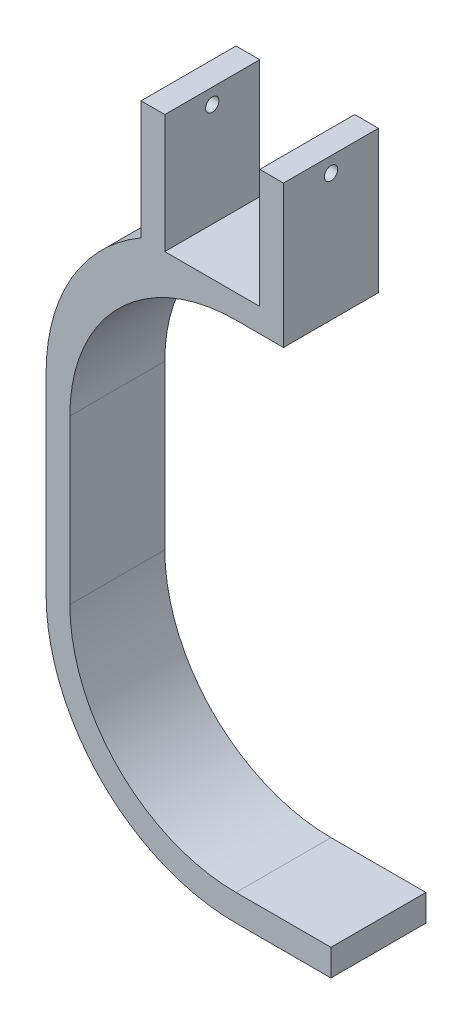
ISO-10303-21;
HEADER;
FILE_DESCRIPTION(('STEP AP214'),'2;1');
FILE_NAME('part.step','',(''),(''),'','','');
FILE_SCHEMA(('AUTOMOTIVE_DESIGN { 1 0 10303 214 1 1 1 1 }'));
ENDSEC;
DATA;
#1=APPLICATION_CONTEXT('core data for automotive mechanical design processes');
#2=APPLICATION_PROTOCOL_DEFINITION('international standard','automotive_design',2000,#1);
#3=PRODUCT_CONTEXT('',#1,'mechanical');
#4=PRODUCT('Part','Part','',(#3));
#5=PRODUCT_RELATED_PRODUCT_CATEGORY('part','',(#4));
#6=PRODUCT_DEFINITION_FORMATION('','',#4);
#7=PRODUCT_DEFINITION_CONTEXT('part definition',#1,'design');
#8=PRODUCT_DEFINITION('design','',#6,#7);
#9=PRODUCT_DEFINITION_SHAPE('','',#8);
#10=(LENGTH_UNIT() NAMED_UNIT(*) SI_UNIT(.MILLI.,.METRE.));
#11=(NAMED_UNIT(*) PLANE_ANGLE_UNIT() SI_UNIT($,.RADIAN.));
#12=(NAMED_UNIT(*) SI_UNIT($,.STERADIAN.) SOLID_ANGLE_UNIT());
#13=UNCERTAINTY_MEASURE_WITH_UNIT(LENGTH_MEASURE(1.E-05),#10,'distance_accuracy_value','');
#14=(GEOMETRIC_REPRESENTATION_CONTEXT(3) GLOBAL_UNCERTAINTY_ASSIGNED_CONTEXT((#13)) GLOBAL_UNIT_ASSIGNED_CONTEXT((#10,
#11,#12)) REPRESENTATION_CONTEXT('',''));
#15=CARTESIAN_POINT('',(0.,0.,0.));
#16=DIRECTION('',(0.,0.,1.));
#17=DIRECTION('',(1.,0.,0.));
#18=AXIS2_PLACEMENT_3D('',#15,#16,#17);
#19=CARTESIAN_POINT('',(0.,-82.7776810365037,20.));
#20=DIRECTION('',(0.,1.,0.));
#21=DIRECTION('',(0.,0.,1.));
#22=AXIS2_PLACEMENT_3D('',#19,#20,#21);
#23=PLANE('',#22);
#24=DIRECTION('',(1.,0.,0.));
#25=VECTOR('',#24,1.);
#26=CARTESIAN_POINT('',(0.,-82.7776810365037,20.));
#27=LINE('',#26,#25);
#28=CARTESIAN_POINT('',(26.4485078252592,-82.7776810365037,20.));
#29=VERTEX_POINT('',#28);
#30=CARTESIAN_POINT('',(46.4485078252592,-82.7776810365037,20.));
#31=VERTEX_POINT('',#30);
#32=EDGE_CURVE('E205',#29,#31,#27,.T.);
#33=ORIENTED_EDGE('',*,*,#32,.F.);
#34=DIRECTION('',(0.,0.,-1.));
#35=VECTOR('',#34,1.);
#36=CARTESIAN_POINT('',(26.4485078252592,-82.7776810365037,20.));
#37=LINE('',#36,#35);
#38=CARTESIAN_POINT('',(26.4485078252592,-82.7776810365037,0.));
#39=VERTEX_POINT('',#38);
#40=EDGE_CURVE('E284',#29,#39,#37,.T.);
#41=ORIENTED_EDGE('',*,*,#40,.T.);
#42=DIRECTION('',(1.,0.,0.));
#43=VECTOR('',#42,1.);
#44=CARTESIAN_POINT('',(0.,-82.7776810365037,0.));
#45=LINE('',#44,#43);
#46=CARTESIAN_POINT('',(46.4485078252592,-82.7776810365037,0.));
#47=VERTEX_POINT('',#46);
#48=EDGE_CURVE('E204',#39,#47,#45,.T.);
#49=ORIENTED_EDGE('',*,*,#48,.T.);
#50=DIRECTION('',(0.,0.,-1.));
#51=VECTOR('',#50,1.);
#52=CARTESIAN_POINT('',(46.4485078252592,-82.7776810365037,20.));
#53=LINE('',#52,#51);
#54=EDGE_CURVE('E263',#31,#47,#53,.T.);
#55=ORIENTED_EDGE('',*,*,#54,.F.);
#56=EDGE_LOOP('',(#33,#41,#49,#55));
#57=FACE_BOUND('',#56,.T.);
#58=ADVANCED_FACE('F35',(#57),#23,.F.);
#59=CARTESIAN_POINT('',(46.4485078252592,0.,20.));
#60=DIRECTION('',(-1.,0.,0.));
#61=DIRECTION('',(0.,0.,1.));
#62=AXIS2_PLACEMENT_3D('',#59,#60,#61);
#63=PLANE('',#62);
#64=DIRECTION('',(0.,1.,0.));
#65=VECTOR('',#64,1.);
#66=CARTESIAN_POINT('',(46.4485078252592,0.,0.));
#67=LINE('',#66,#65);
#68=CARTESIAN_POINT('',(46.4485078252592,-77.1701064670225,0.));
#69=VERTEX_POINT('',#68);
#70=EDGE_CURVE('E235',#47,#69,#67,.T.);
#71=ORIENTED_EDGE('',*,*,#70,.T.);
#72=DIRECTION('',(0.,0.,-1.));
#73=VECTOR('',#72,1.);
#74=CARTESIAN_POINT('',(46.4485078252592,-77.1701064670225,20.));
#75=LINE('',#74,#73);
#76=CARTESIAN_POINT('',(46.4485078252592,-77.1701064670225,20.));
#77=VERTEX_POINT('',#76);
#78=EDGE_CURVE('E260',#77,#69,#75,.T.);
#79=ORIENTED_EDGE('',*,*,#78,.F.);
#80=DIRECTION('',(0.,1.,0.));
#81=VECTOR('',#80,1.);
#82=CARTESIAN_POINT('',(46.4485078252592,0.,20.));
#83=LINE('',#82,#81);
#84=EDGE_CURVE('E207',#31,#77,#83,.T.);
#85=ORIENTED_EDGE('',*,*,#84,.F.);
#86=ORIENTED_EDGE('',*,*,#54,.T.);
#87=EDGE_LOOP('',(#71,#79,#85,#86));
#88=FACE_BOUND('',#87,.T.);
#89=ADVANCED_FACE('F313',(#88),#63,.F.);
#90=CARTESIAN_POINT('',(0.,-77.1701064670225,20.));
#91=DIRECTION('',(0.,1.,0.));
#92=DIRECTION('',(0.,0.,1.));
#93=AXIS2_PLACEMENT_3D('',#90,#91,#92);
#94=PLANE('',#93);
#95=DIRECTION('',(1.,0.,0.));
#96=VECTOR('',#95,1.);
#97=CARTESIAN_POINT('',(0.,-77.1701064670225,0.));
#98=LINE('',#97,#96);
#99=CARTESIAN_POINT('',(26.4485078252592,-77.1701064670225,0.));
#100=VERTEX_POINT('',#99);
#101=EDGE_CURVE('E238',#100,#69,#98,.T.);
#102=ORIENTED_EDGE('',*,*,#101,.F.);
#103=DIRECTION('',(0.,0.,-1.));
#104=VECTOR('',#103,1.);
#105=CARTESIAN_POINT('',(26.4485078252592,-77.1701064670225,20.));
#106=LINE('',#105,#104);
#107=CARTESIAN_POINT('',(26.4485078252592,-77.1701064670225,20.));
#108=VERTEX_POINT('',#107);
#109=EDGE_CURVE('E271',#100,#108,#106,.F.);
#110=ORIENTED_EDGE('',*,*,#109,.T.);
#111=DIRECTION('',(1.,0.,0.));
#112=VECTOR('',#111,1.);
#113=CARTESIAN_POINT('',(0.,-77.1701064670225,20.));
#114=LINE('',#113,#112);
#115=EDGE_CURVE('E211',#108,#77,#114,.T.);
#116=ORIENTED_EDGE('',*,*,#115,.T.);
#117=ORIENTED_EDGE('',*,*,#78,.T.);
#118=EDGE_LOOP('',(#102,#110,#116,#117));
#119=FACE_BOUND('',#118,.T.);
#120=ADVANCED_FACE('F316',(#119),#94,.T.);
#121=CARTESIAN_POINT('',(-8.55149217474084,0.,20.));
#122=DIRECTION('',(1.,0.,0.));
#123=DIRECTION('',(0.,1.,0.));
#124=AXIS2_PLACEMENT_3D('',#121,#122,#123);
#125=PLANE('',#124);
#126=DIRECTION('',(0.,-1.,0.));
#127=VECTOR('',#126,1.);
#128=CARTESIAN_POINT('',(-8.55149217474084,0.,20.));
#129=LINE('',#128,#127);
#130=CARTESIAN_POINT('',(-8.55149217474084,-7.77768103650374,20.));
#131=VERTEX_POINT('',#130);
#132=CARTESIAN_POINT('',(-8.55149217474083,-42.1701064670225,20.));
#133=VERTEX_POINT('',#132);
#134=EDGE_CURVE('E213',#131,#133,#129,.T.);
#135=ORIENTED_EDGE('',*,*,#134,.T.);
#136=DIRECTION('',(0.,0.,-1.));
#137=VECTOR('',#136,1.);
#138=CARTESIAN_POINT('',(-8.55149217474083,-42.1701064670225,0.));
#139=LINE('',#138,#137);
#140=CARTESIAN_POINT('',(-8.55149217474083,-42.1701064670225,0.));
#141=VERTEX_POINT('',#140);
#142=EDGE_CURVE('E268',#133,#141,#139,.T.);
#143=ORIENTED_EDGE('',*,*,#142,.T.);
#144=DIRECTION('',(0.,-1.,0.));
#145=VECTOR('',#144,1.);
#146=CARTESIAN_POINT('',(-8.55149217474084,0.,0.));
#147=LINE('',#146,#145);
#148=CARTESIAN_POINT('',(-8.55149217474084,-7.77768103650374,0.));
#149=VERTEX_POINT('',#148);
#150=EDGE_CURVE('E240',#149,#141,#147,.T.);
#151=ORIENTED_EDGE('',*,*,#150,.F.);
#152=DIRECTION('',(0.,0.,-1.));
#153=VECTOR('',#152,1.);
#154=CARTESIAN_POINT('',(-8.55149217474084,-7.77768103650374,20.));
#155=LINE('',#154,#153);
#156=EDGE_CURVE('E266',#149,#131,#155,.F.);
#157=ORIENTED_EDGE('',*,*,#156,.T.);
#158=EDGE_LOOP('',(#135,#143,#151,#157));
#159=FACE_BOUND('',#158,.T.);
#160=ADVANCED_FACE('F325',(#159),#125,.T.);
#161=CARTESIAN_POINT('',(0.,27.2223189634963,20.));
#162=DIRECTION('',(0.,-1.,0.));
#163=DIRECTION('',(0.,0.,-1.));
#164=AXIS2_PLACEMENT_3D('',#161,#162,#163);
#165=PLANE('',#164);
#166=DIRECTION('',(-1.,0.,0.));
#167=VECTOR('',#166,1.);
#168=CARTESIAN_POINT('',(0.,27.2223189634963,20.));
#169=LINE('',#168,#167);
#170=CARTESIAN_POINT('',(36.4485078252592,27.2223189634963,20.));
#171=VERTEX_POINT('',#170);
#172=CARTESIAN_POINT('',(26.4485078252592,27.2223189634963,20.));
#173=VERTEX_POINT('',#172);
#174=EDGE_CURVE('E216',#171,#173,#169,.T.);
#175=ORIENTED_EDGE('',*,*,#174,.T.);
#176=DIRECTION('',(0.,0.,-1.));
#177=VECTOR('',#176,1.);
#178=CARTESIAN_POINT('',(26.4485078252592,27.2223189634963,0.));
#179=LINE('',#178,#177);
#180=CARTESIAN_POINT('',(26.4485078252592,27.2223189634963,0.));
#181=VERTEX_POINT('',#180);
#182=EDGE_CURVE('E273',#173,#181,#179,.T.);
#183=ORIENTED_EDGE('',*,*,#182,.T.);
#184=DIRECTION('',(-1.,0.,0.));
#185=VECTOR('',#184,1.);
#186=CARTESIAN_POINT('',(0.,27.2223189634963,0.));
#187=LINE('',#186,#185);
#188=CARTESIAN_POINT('',(36.4485078252592,27.2223189634963,0.));
#189=VERTEX_POINT('',#188);
#190=EDGE_CURVE('E166',#189,#181,#187,.T.);
#191=ORIENTED_EDGE('',*,*,#190,.F.);
#192=DIRECTION('',(0.,0.,-1.));
#193=VECTOR('',#192,1.);
#194=CARTESIAN_POINT('',(36.4485078252592,27.2223189634963,20.));
#195=LINE('',#194,#193);
#196=EDGE_CURVE('E161',#171,#189,#195,.T.);
#197=ORIENTED_EDGE('',*,*,#196,.F.);
#198=EDGE_LOOP('',(#175,#183,#191,#197));
#199=FACE_BOUND('',#198,.T.);
#200=ADVANCED_FACE('F332',(#199),#165,.T.);
#201=CARTESIAN_POINT('',(36.4485078252592,0.,20.));
#202=DIRECTION('',(-1.,0.,0.));
#203=DIRECTION('',(0.,0.,1.));
#204=AXIS2_PLACEMENT_3D('',#201,#202,#203);
#205=PLANE('',#204);
#206=CARTESIAN_POINT('',(36.4485078252592,54.0223189634963,10.));
#207=DIRECTION('',(1.,0.,0.));
#208=DIRECTION('',(0.,0.,-1.));
#209=AXIS2_PLACEMENT_3D('',#206,#207,#208);
#210=CIRCLE('',#209,1.4);
#211=CARTESIAN_POINT('',(36.4485078252592,54.0223189634963,8.6));
#212=VERTEX_POINT('',#211);
#213=EDGE_CURVE('E566',#212,#212,#210,.T.);
#214=ORIENTED_EDGE('',*,*,#213,.F.);
#215=EDGE_LOOP('',(#214));
#216=FACE_BOUND('',#215,.T.);
#217=DIRECTION('',(0.,1.,0.));
#218=VECTOR('',#217,1.);
#219=CARTESIAN_POINT('',(36.4485078252592,0.,0.));
#220=LINE('',#219,#218);
#221=CARTESIAN_POINT('',(36.4485078252592,57.2223189634963,0.));
#222=VERTEX_POINT('',#221);
#223=EDGE_CURVE('E155',#189,#222,#220,.T.);
#224=ORIENTED_EDGE('',*,*,#223,.T.);
#225=DIRECTION('',(0.,0.,-1.));
#226=VECTOR('',#225,1.);
#227=CARTESIAN_POINT('',(36.4485078252592,57.2223189634963,0.));
#228=LINE('',#227,#226);
#229=CARTESIAN_POINT('',(36.4485078252592,57.2223189634963,20.));
#230=VERTEX_POINT('',#229);
#231=EDGE_CURVE('E160',#230,#222,#228,.T.);
#232=ORIENTED_EDGE('',*,*,#231,.F.);
#233=DIRECTION('',(0.,1.,0.));
#234=VECTOR('',#233,1.);
#235=CARTESIAN_POINT('',(36.4485078252592,0.,20.));
#236=LINE('',#235,#234);
#237=EDGE_CURVE('E219',#171,#230,#236,.T.);
#238=ORIENTED_EDGE('',*,*,#237,.F.);
#239=ORIENTED_EDGE('',*,*,#196,.T.);
#240=EDGE_LOOP('',(#224,#232,#238,#239));
#241=FACE_BOUND('',#240,.T.);
#242=ADVANCED_FACE('F157',(#216,#241),#205,.F.);
#243=CARTESIAN_POINT('',(31.4485078252592,0.,20.));
#244=DIRECTION('',(1.,0.,0.));
#245=DIRECTION('',(0.,0.,-1.));
#246=AXIS2_PLACEMENT_3D('',#243,#244,#245);
#247=PLANE('',#246);
#248=CARTESIAN_POINT('',(31.4485078252592,54.0223189634963,10.));
#249=DIRECTION('',(1.,0.,0.));
#250=DIRECTION('',(0.,0.,-1.));
#251=AXIS2_PLACEMENT_3D('',#248,#249,#250);
#252=CIRCLE('',#251,1.4);
#253=CARTESIAN_POINT('',(31.4485078252592,54.0223189634963,8.6));
#254=VERTEX_POINT('',#253);
#255=EDGE_CURVE('E183',#254,#254,#252,.T.);
#256=ORIENTED_EDGE('',*,*,#255,.T.);
#257=EDGE_LOOP('',(#256));
#258=FACE_BOUND('',#257,.T.);
#259=DIRECTION('',(0.,-1.,0.));
#260=VECTOR('',#259,1.);
#261=CARTESIAN_POINT('',(31.4485078252592,0.,0.));
#262=LINE('',#261,#260);
#263=CARTESIAN_POINT('',(31.4485078252592,57.2223189634963,0.));
#264=VERTEX_POINT('',#263);
#265=CARTESIAN_POINT('',(31.4485078252592,32.2223189634963,0.));
#266=VERTEX_POINT('',#265);
#267=EDGE_CURVE('E165',#264,#266,#262,.T.);
#268=ORIENTED_EDGE('',*,*,#267,.T.);
#269=DIRECTION('',(0.,0.,-1.));
#270=VECTOR('',#269,1.);
#271=CARTESIAN_POINT('',(31.4485078252592,32.2223189634963,20.));
#272=LINE('',#271,#270);
#273=CARTESIAN_POINT('',(31.4485078252592,32.2223189634963,20.));
#274=VERTEX_POINT('',#273);
#275=EDGE_CURVE('E257',#274,#266,#272,.T.);
#276=ORIENTED_EDGE('',*,*,#275,.F.);
#277=DIRECTION('',(0.,-1.,0.));
#278=VECTOR('',#277,1.);
#279=CARTESIAN_POINT('',(31.4485078252592,0.,20.));
#280=LINE('',#279,#278);
#281=CARTESIAN_POINT('',(31.4485078252592,57.2223189634963,20.));
#282=VERTEX_POINT('',#281);
#283=EDGE_CURVE('E221',#282,#274,#280,.T.);
#284=ORIENTED_EDGE('',*,*,#283,.F.);
#285=DIRECTION('',(0.,0.,1.));
#286=VECTOR('',#285,1.);
#287=CARTESIAN_POINT('',(31.4485078252592,57.2223189634963,0.));
#288=LINE('',#287,#286);
#289=EDGE_CURVE('E177',#264,#282,#288,.T.);
#290=ORIENTED_EDGE('',*,*,#289,.F.);
#291=EDGE_LOOP('',(#268,#276,#284,#290));
#292=FACE_BOUND('',#291,.T.);
#293=ADVANCED_FACE('F337',(#258,#292),#247,.F.);
#294=CARTESIAN_POINT('',(0.,32.2223189634963,20.));
#295=DIRECTION('',(0.,1.,0.));
#296=DIRECTION('',(0.,0.,1.));
#297=AXIS2_PLACEMENT_3D('',#294,#295,#296);
#298=PLANE('',#297);
#299=DIRECTION('',(1.,0.,0.));
#300=VECTOR('',#299,1.);
#301=CARTESIAN_POINT('',(0.,32.2223189634963,0.));
#302=LINE('',#301,#300);
#303=CARTESIAN_POINT('',(11.4485078252592,32.2223189634963,0.));
#304=VERTEX_POINT('',#303);
#305=EDGE_CURVE('E245',#304,#266,#302,.T.);
#306=ORIENTED_EDGE('',*,*,#305,.F.);
#307=DIRECTION('',(0.,0.,-1.));
#308=VECTOR('',#307,1.);
#309=CARTESIAN_POINT('',(11.4485078252592,32.2223189634963,20.));
#310=LINE('',#309,#308);
#311=CARTESIAN_POINT('',(11.4485078252592,32.2223189634963,20.));
#312=VERTEX_POINT('',#311);
#313=EDGE_CURVE('E255',#312,#304,#310,.T.);
#314=ORIENTED_EDGE('',*,*,#313,.F.);
#315=DIRECTION('',(1.,0.,0.));
#316=VECTOR('',#315,1.);
#317=CARTESIAN_POINT('',(0.,32.2223189634963,20.));
#318=LINE('',#317,#316);
#319=EDGE_CURVE('E223',#312,#274,#318,.T.);
#320=ORIENTED_EDGE('',*,*,#319,.T.);
#321=ORIENTED_EDGE('',*,*,#275,.T.);
#322=EDGE_LOOP('',(#306,#314,#320,#321));
#323=FACE_BOUND('',#322,.T.);
#324=ADVANCED_FACE('F340',(#323),#298,.T.);
#325=CARTESIAN_POINT('',(11.4485078252592,0.,20.));
#326=DIRECTION('',(1.,0.,0.));
#327=DIRECTION('',(0.,1.,0.));
#328=AXIS2_PLACEMENT_3D('',#325,#326,#327);
#329=PLANE('',#328);
#330=CARTESIAN_POINT('',(11.4485078252592,54.0223189634963,10.));
#331=DIRECTION('',(1.,0.,0.));
#332=DIRECTION('',(0.,1.,0.));
#333=AXIS2_PLACEMENT_3D('',#330,#331,#332);
#334=CIRCLE('',#333,1.4);
#335=CARTESIAN_POINT('',(11.4485078252592,55.4223189634963,10.));
#336=VERTEX_POINT('',#335);
#337=EDGE_CURVE('E186',#336,#336,#334,.T.);
#338=ORIENTED_EDGE('',*,*,#337,.F.);
#339=EDGE_LOOP('',(#338));
#340=FACE_BOUND('',#339,.T.);
#341=DIRECTION('',(0.,-1.,0.));
#342=VECTOR('',#341,1.);
#343=CARTESIAN_POINT('',(11.4485078252592,0.,0.));
#344=LINE('',#343,#342);
#345=CARTESIAN_POINT('',(11.4485078252592,57.2223189634963,0.));
#346=VERTEX_POINT('',#345);
#347=EDGE_CURVE('E247',#346,#304,#344,.T.);
#348=ORIENTED_EDGE('',*,*,#347,.F.);
#349=DIRECTION('',(0.,0.,-1.));
#350=VECTOR('',#349,1.);
#351=CARTESIAN_POINT('',(11.4485078252592,57.2223189634963,0.));
#352=LINE('',#351,#350);
#353=CARTESIAN_POINT('',(11.4485078252592,57.2223189634963,20.));
#354=VERTEX_POINT('',#353);
#355=EDGE_CURVE('E198',#354,#346,#352,.T.);
#356=ORIENTED_EDGE('',*,*,#355,.F.);
#357=DIRECTION('',(0.,-1.,0.));
#358=VECTOR('',#357,1.);
#359=CARTESIAN_POINT('',(11.4485078252592,0.,20.));
#360=LINE('',#359,#358);
#361=EDGE_CURVE('E226',#354,#312,#360,.T.);
#362=ORIENTED_EDGE('',*,*,#361,.T.);
#363=ORIENTED_EDGE('',*,*,#313,.T.);
#364=EDGE_LOOP('',(#348,#356,#362,#363));
#365=FACE_BOUND('',#364,.T.);
#366=ADVANCED_FACE('F342',(#340,#365),#329,.T.);
#367=CARTESIAN_POINT('',(6.44850782525916,0.,20.));
#368=DIRECTION('',(-1.,0.,0.));
#369=DIRECTION('',(0.,0.,1.));
#370=AXIS2_PLACEMENT_3D('',#367,#368,#369);
#371=PLANE('',#370);
#372=CARTESIAN_POINT('',(6.44850782525916,54.0223189634963,10.));
#373=DIRECTION('',(-1.,0.,0.));
#374=DIRECTION('',(0.,0.,1.));
#375=AXIS2_PLACEMENT_3D('',#372,#373,#374);
#376=CIRCLE('',#375,1.4);
#377=CARTESIAN_POINT('',(6.44850782525916,54.0223189634963,11.4));
#378=VERTEX_POINT('',#377);
#379=EDGE_CURVE('E39',#378,#378,#376,.T.);
#380=ORIENTED_EDGE('',*,*,#379,.F.);
#381=EDGE_LOOP('',(#380));
#382=FACE_BOUND('',#381,.T.);
#383=DIRECTION('',(0.,1.,0.));
#384=VECTOR('',#383,1.);
#385=CARTESIAN_POINT('',(6.44850782525916,0.,0.));
#386=LINE('',#385,#384);
#387=CARTESIAN_POINT('',(6.44850782525916,32.2223189634963,0.));
#388=VERTEX_POINT('',#387);
#389=CARTESIAN_POINT('',(6.44850782525916,57.2223189634963,0.));
#390=VERTEX_POINT('',#389);
#391=EDGE_CURVE('E250',#388,#390,#386,.T.);
#392=ORIENTED_EDGE('',*,*,#391,.F.);
#393=DIRECTION('',(0.,0.,-1.));
#394=VECTOR('',#393,1.);
#395=CARTESIAN_POINT('',(6.44850782525916,32.2223189634963,20.));
#396=LINE('',#395,#394);
#397=CARTESIAN_POINT('',(6.44850782525916,32.2223189634963,20.));
#398=VERTEX_POINT('',#397);
#399=EDGE_CURVE('E233',#398,#388,#396,.T.);
#400=ORIENTED_EDGE('',*,*,#399,.F.);
#401=DIRECTION('',(0.,1.,0.));
#402=VECTOR('',#401,1.);
#403=CARTESIAN_POINT('',(6.44850782525916,0.,20.));
#404=LINE('',#403,#402);
#405=CARTESIAN_POINT('',(6.44850782525916,57.2223189634963,20.));
#406=VERTEX_POINT('',#405);
#407=EDGE_CURVE('E229',#398,#406,#404,.T.);
#408=ORIENTED_EDGE('',*,*,#407,.T.);
#409=DIRECTION('',(0.,0.,1.));
#410=VECTOR('',#409,1.);
#411=CARTESIAN_POINT('',(6.44850782525916,57.2223189634963,0.));
#412=LINE('',#411,#410);
#413=EDGE_CURVE('E192',#390,#406,#412,.T.);
#414=ORIENTED_EDGE('',*,*,#413,.F.);
#415=EDGE_LOOP('',(#392,#400,#408,#414));
#416=FACE_BOUND('',#415,.T.);
#417=ADVANCED_FACE('F350',(#382,#416),#371,.T.);
#418=CARTESIAN_POINT('',(-13.5514921747408,0.,20.));
#419=DIRECTION('',(1.,0.,0.));
#420=DIRECTION('',(0.,1.,0.));
#421=AXIS2_PLACEMENT_3D('',#418,#419,#420);
#422=PLANE('',#421);
#423=DIRECTION('',(0.,-1.,0.));
#424=VECTOR('',#423,1.);
#425=CARTESIAN_POINT('',(-13.5514921747408,0.,0.));
#426=LINE('',#425,#424);
#427=CARTESIAN_POINT('',(-13.5514921747408,-2.4186971878813,0.));
#428=VERTEX_POINT('',#427);
#429=CARTESIAN_POINT('',(-13.5514921747408,-42.7776810365038,0.));
#430=VERTEX_POINT('',#429);
#431=EDGE_CURVE('E208',#428,#430,#426,.T.);
#432=ORIENTED_EDGE('',*,*,#431,.T.);
#433=DIRECTION('',(0.,0.,-1.));
#434=VECTOR('',#433,1.);
#435=CARTESIAN_POINT('',(-13.5514921747408,-42.7776810365038,20.));
#436=LINE('',#435,#434);
#437=CARTESIAN_POINT('',(-13.5514921747408,-42.7776810365038,20.));
#438=VERTEX_POINT('',#437);
#439=EDGE_CURVE('E51',#430,#438,#436,.F.);
#440=ORIENTED_EDGE('',*,*,#439,.T.);
#441=DIRECTION('',(0.,-1.,0.));
#442=VECTOR('',#441,1.);
#443=CARTESIAN_POINT('',(-13.5514921747408,0.,20.));
#444=LINE('',#443,#442);
#445=CARTESIAN_POINT('',(-13.5514921747408,-2.4186971878813,20.));
#446=VERTEX_POINT('',#445);
#447=EDGE_CURVE('E231',#446,#438,#444,.T.);
#448=ORIENTED_EDGE('',*,*,#447,.F.);
#449=DIRECTION('',(0.,0.,-1.));
#450=VECTOR('',#449,1.);
#451=CARTESIAN_POINT('',(-13.5514921747408,-2.4186971878813,20.));
#452=LINE('',#451,#450);
#453=EDGE_CURVE('E291',#446,#428,#452,.T.);
#454=ORIENTED_EDGE('',*,*,#453,.T.);
#455=EDGE_LOOP('',(#432,#440,#448,#454));
#456=FACE_BOUND('',#455,.T.);
#457=ADVANCED_FACE('F297',(#456),#422,.F.);
#458=CARTESIAN_POINT('',(0.,0.,20.));
#459=DIRECTION('',(0.,0.,1.));
#460=DIRECTION('',(1.,0.,0.));
#461=AXIS2_PLACEMENT_3D('',#458,#459,#460);
#462=PLANE('',#461);
#463=ORIENTED_EDGE('',*,*,#447,.T.);
#464=CARTESIAN_POINT('',(26.4485078252592,-42.7776810365037,20.));
#465=DIRECTION('',(0.,0.,1.));
#466=DIRECTION('',(1.,0.,0.));
#467=AXIS2_PLACEMENT_3D('',#464,#465,#466);
#468=CIRCLE('',#467,40.);
#469=EDGE_CURVE('E11',#438,#29,#468,.T.);
#470=ORIENTED_EDGE('',*,*,#469,.T.);
#471=ORIENTED_EDGE('',*,*,#32,.T.);
#472=ORIENTED_EDGE('',*,*,#84,.T.);
#473=ORIENTED_EDGE('',*,*,#115,.F.);
#474=CARTESIAN_POINT('',(26.4485078252592,-42.1701064670225,20.));
#475=DIRECTION('',(0.,0.,1.));
#476=DIRECTION('',(1.,0.,0.));
#477=AXIS2_PLACEMENT_3D('',#474,#475,#476);
#478=CIRCLE('',#477,35.);
#479=EDGE_CURVE('E278',#108,#133,#478,.F.);
#480=ORIENTED_EDGE('',*,*,#479,.T.);
#481=ORIENTED_EDGE('',*,*,#134,.F.);
#482=CARTESIAN_POINT('',(26.4485078252592,-7.77768103650374,20.));
#483=DIRECTION('',(0.,0.,1.));
#484=DIRECTION('',(1.,0.,0.));
#485=AXIS2_PLACEMENT_3D('',#482,#483,#484);
#486=CIRCLE('',#485,35.);
#487=EDGE_CURVE('E282',#131,#173,#486,.F.);
#488=ORIENTED_EDGE('',*,*,#487,.T.);
#489=ORIENTED_EDGE('',*,*,#174,.F.);
#490=ORIENTED_EDGE('',*,*,#237,.T.);
#491=DIRECTION('',(1.,0.,0.));
#492=VECTOR('',#491,1.);
#493=CARTESIAN_POINT('',(36.4485078252592,57.2223189634963,20.));
#494=LINE('',#493,#492);
#495=EDGE_CURVE('E182',#282,#230,#494,.T.);
#496=ORIENTED_EDGE('',*,*,#495,.F.);
#497=ORIENTED_EDGE('',*,*,#283,.T.);
#498=ORIENTED_EDGE('',*,*,#319,.F.);
#499=ORIENTED_EDGE('',*,*,#361,.F.);
#500=DIRECTION('',(1.,0.,0.));
#501=VECTOR('',#500,1.);
#502=CARTESIAN_POINT('',(6.44850782525916,57.2223189634963,20.));
#503=LINE('',#502,#501);
#504=EDGE_CURVE('E195',#406,#354,#503,.T.);
#505=ORIENTED_EDGE('',*,*,#504,.F.);
#506=ORIENTED_EDGE('',*,*,#407,.F.);
#507=CARTESIAN_POINT('',(26.4485078252592,-2.41869718788128,20.));
#508=DIRECTION('',(0.,0.,1.));
#509=DIRECTION('',(1.,0.,0.));
#510=AXIS2_PLACEMENT_3D('',#507,#508,#509);
#511=CIRCLE('',#510,40.);
#512=EDGE_CURVE('E44',#398,#446,#511,.T.);
#513=ORIENTED_EDGE('',*,*,#512,.T.);
#514=EDGE_LOOP('',(#463,#470,#471,#472,#473,#480,#481,#488,#489,#490,#496,#497,#498,#499,#505,
#506,#513));
#515=FACE_BOUND('',#514,.T.);
#516=ADVANCED_FACE('F309',(#515),#462,.T.);
#517=CARTESIAN_POINT('',(0.,0.,0.));
#518=DIRECTION('',(0.,0.,1.));
#519=DIRECTION('',(1.,0.,0.));
#520=AXIS2_PLACEMENT_3D('',#517,#518,#519);
#521=PLANE('',#520);
#522=ORIENTED_EDGE('',*,*,#48,.F.);
#523=CARTESIAN_POINT('',(26.4485078252592,-42.7776810365037,0.));
#524=DIRECTION('',(0.,0.,1.));
#525=DIRECTION('',(1.,0.,0.));
#526=AXIS2_PLACEMENT_3D('',#523,#524,#525);
#527=CIRCLE('',#526,40.);
#528=EDGE_CURVE('E289',#39,#430,#527,.F.);
#529=ORIENTED_EDGE('',*,*,#528,.T.);
#530=ORIENTED_EDGE('',*,*,#431,.F.);
#531=CARTESIAN_POINT('',(26.4485078252592,-2.41869718788128,0.));
#532=DIRECTION('',(0.,0.,1.));
#533=DIRECTION('',(1.,0.,0.));
#534=AXIS2_PLACEMENT_3D('',#531,#532,#533);
#535=CIRCLE('',#534,40.);
#536=EDGE_CURVE('E287',#428,#388,#535,.F.);
#537=ORIENTED_EDGE('',*,*,#536,.T.);
#538=ORIENTED_EDGE('',*,*,#391,.T.);
#539=DIRECTION('',(-1.,0.,0.));
#540=VECTOR('',#539,1.);
#541=CARTESIAN_POINT('',(6.44850782525916,57.2223189634963,0.));
#542=LINE('',#541,#540);
#543=EDGE_CURVE('E201',#346,#390,#542,.T.);
#544=ORIENTED_EDGE('',*,*,#543,.F.);
#545=ORIENTED_EDGE('',*,*,#347,.T.);
#546=ORIENTED_EDGE('',*,*,#305,.T.);
#547=ORIENTED_EDGE('',*,*,#267,.F.);
#548=DIRECTION('',(-1.,0.,0.));
#549=VECTOR('',#548,1.);
#550=CARTESIAN_POINT('',(36.4485078252592,57.2223189634963,0.));
#551=LINE('',#550,#549);
#552=EDGE_CURVE('E169',#222,#264,#551,.T.);
#553=ORIENTED_EDGE('',*,*,#552,.F.);
#554=ORIENTED_EDGE('',*,*,#223,.F.);
#555=ORIENTED_EDGE('',*,*,#190,.T.);
#556=CARTESIAN_POINT('',(26.4485078252592,-7.77768103650374,0.));
#557=DIRECTION('',(0.,0.,1.));
#558=DIRECTION('',(1.,0.,0.));
#559=AXIS2_PLACEMENT_3D('',#556,#557,#558);
#560=CIRCLE('',#559,35.);
#561=EDGE_CURVE('E280',#181,#149,#560,.T.);
#562=ORIENTED_EDGE('',*,*,#561,.T.);
#563=ORIENTED_EDGE('',*,*,#150,.T.);
#564=CARTESIAN_POINT('',(26.4485078252592,-42.1701064670225,0.));
#565=DIRECTION('',(0.,0.,1.));
#566=DIRECTION('',(1.,0.,0.));
#567=AXIS2_PLACEMENT_3D('',#564,#565,#566);
#568=CIRCLE('',#567,35.);
#569=EDGE_CURVE('E276',#141,#100,#568,.T.);
#570=ORIENTED_EDGE('',*,*,#569,.T.);
#571=ORIENTED_EDGE('',*,*,#101,.T.);
#572=ORIENTED_EDGE('',*,*,#70,.F.);
#573=EDGE_LOOP('',(#522,#529,#530,#537,#538,#544,#545,#546,#547,#553,#554,#555,#562,#563,#570,
#571,#572));
#574=FACE_BOUND('',#573,.T.);
#575=ADVANCED_FACE('F171',(#574),#521,.F.);
#576=CARTESIAN_POINT('',(26.4485078252592,-42.1701064670225,20.));
#577=DIRECTION('',(0.,0.,1.));
#578=DIRECTION('',(1.,0.,0.));
#579=AXIS2_PLACEMENT_3D('',#576,#577,#578);
#580=CYLINDRICAL_SURFACE('',#579,35.);
#581=ORIENTED_EDGE('',*,*,#479,.F.);
#582=ORIENTED_EDGE('',*,*,#109,.F.);
#583=ORIENTED_EDGE('',*,*,#569,.F.);
#584=ORIENTED_EDGE('',*,*,#142,.F.);
#585=EDGE_LOOP('',(#581,#582,#583,#584));
#586=FACE_BOUND('',#585,.T.);
#587=ADVANCED_FACE('F322',(#586),#580,.F.);
#588=CARTESIAN_POINT('',(26.4485078252592,-7.77768103650374,20.));
#589=DIRECTION('',(0.,0.,1.));
#590=DIRECTION('',(1.,0.,0.));
#591=AXIS2_PLACEMENT_3D('',#588,#589,#590);
#592=CYLINDRICAL_SURFACE('',#591,35.);
#593=ORIENTED_EDGE('',*,*,#487,.F.);
#594=ORIENTED_EDGE('',*,*,#156,.F.);
#595=ORIENTED_EDGE('',*,*,#561,.F.);
#596=ORIENTED_EDGE('',*,*,#182,.F.);
#597=EDGE_LOOP('',(#593,#594,#595,#596));
#598=FACE_BOUND('',#597,.T.);
#599=ADVANCED_FACE('F330',(#598),#592,.F.);
#600=CARTESIAN_POINT('',(26.4485078252592,-42.7776810365037,20.));
#601=DIRECTION('',(0.,0.,-1.));
#602=DIRECTION('',(-1.,0.,0.));
#603=AXIS2_PLACEMENT_3D('',#600,#601,#602);
#604=CYLINDRICAL_SURFACE('',#603,40.);
#605=ORIENTED_EDGE('',*,*,#469,.F.);
#606=ORIENTED_EDGE('',*,*,#439,.F.);
#607=ORIENTED_EDGE('',*,*,#528,.F.);
#608=ORIENTED_EDGE('',*,*,#40,.F.);
#609=EDGE_LOOP('',(#605,#606,#607,#608));
#610=FACE_BOUND('',#609,.T.);
#611=ADVANCED_FACE('F304',(#610),#604,.T.);
#612=CARTESIAN_POINT('',(26.4485078252592,-2.41869718788128,20.));
#613=DIRECTION('',(0.,0.,-1.));
#614=DIRECTION('',(-1.,0.,0.));
#615=AXIS2_PLACEMENT_3D('',#612,#613,#614);
#616=CYLINDRICAL_SURFACE('',#615,40.);
#617=ORIENTED_EDGE('',*,*,#512,.F.);
#618=ORIENTED_EDGE('',*,*,#399,.T.);
#619=ORIENTED_EDGE('',*,*,#536,.F.);
#620=ORIENTED_EDGE('',*,*,#453,.F.);
#621=EDGE_LOOP('',(#617,#618,#619,#620));
#622=FACE_BOUND('',#621,.T.);
#623=ADVANCED_FACE('F37',(#622),#616,.T.);
#624=CARTESIAN_POINT('',(0.,57.2223189634963,0.));
#625=DIRECTION('',(0.,1.,0.));
#626=DIRECTION('',(0.,0.,1.));
#627=AXIS2_PLACEMENT_3D('',#624,#625,#626);
#628=PLANE('',#627);
#629=ORIENTED_EDGE('',*,*,#413,.T.);
#630=ORIENTED_EDGE('',*,*,#504,.T.);
#631=ORIENTED_EDGE('',*,*,#355,.T.);
#632=ORIENTED_EDGE('',*,*,#543,.T.);
#633=EDGE_LOOP('',(#629,#630,#631,#632));
#634=FACE_BOUND('',#633,.T.);
#635=ADVANCED_FACE('F346',(#634),#628,.T.);
#636=CARTESIAN_POINT('',(0.,57.2223189634963,0.));
#637=DIRECTION('',(0.,-1.,0.));
#638=DIRECTION('',(0.,0.,-1.));
#639=AXIS2_PLACEMENT_3D('',#636,#637,#638);
#640=PLANE('',#639);
#641=ORIENTED_EDGE('',*,*,#231,.T.);
#642=ORIENTED_EDGE('',*,*,#552,.T.);
#643=ORIENTED_EDGE('',*,*,#289,.T.);
#644=ORIENTED_EDGE('',*,*,#495,.T.);
#645=EDGE_LOOP('',(#641,#642,#643,#644));
#646=FACE_BOUND('',#645,.T.);
#647=ADVANCED_FACE('F180',(#646),#640,.F.);
#648=CARTESIAN_POINT('',(-18.5514921747409,54.0223189634963,10.));
#649=DIRECTION('',(1.,0.,0.));
#650=DIRECTION('',(0.,0.,-1.));
#651=AXIS2_PLACEMENT_3D('',#648,#649,#650);
#652=CYLINDRICAL_SURFACE('',#651,1.4);
#653=ORIENTED_EDGE('',*,*,#337,.T.);
#654=EDGE_LOOP('',(#653));
#655=FACE_BOUND('',#654,.T.);
#656=ORIENTED_EDGE('',*,*,#379,.T.);
#657=EDGE_LOOP('',(#656));
#658=FACE_BOUND('',#657,.T.);
#659=ADVANCED_FACE('F418',(#655,#658),#652,.F.);
#660=ORIENTED_EDGE('',*,*,#213,.T.);
#661=EDGE_LOOP('',(#660));
#662=FACE_BOUND('',#661,.T.);
#663=ORIENTED_EDGE('',*,*,#255,.F.);
#664=EDGE_LOOP('',(#663));
#665=FACE_BOUND('',#664,.T.);
#666=ADVANCED_FACE('F468',(#662,#665),#652,.F.);
#667=CLOSED_SHELL('',(#58,#89,#120,#160,#200,#242,#293,#324,#366,#417,#457,#516,#575,#587,#599,
#611,#623,#635,#647,#659,#666));
#668=MANIFOLD_SOLID_BREP('B2',#667);
#669=ADVANCED_BREP_SHAPE_REPRESENTATION('',(#18,#668),#14);
#670=SHAPE_DEFINITION_REPRESENTATION(#9,#669);
ENDSEC;
END-ISO-10303-21;
